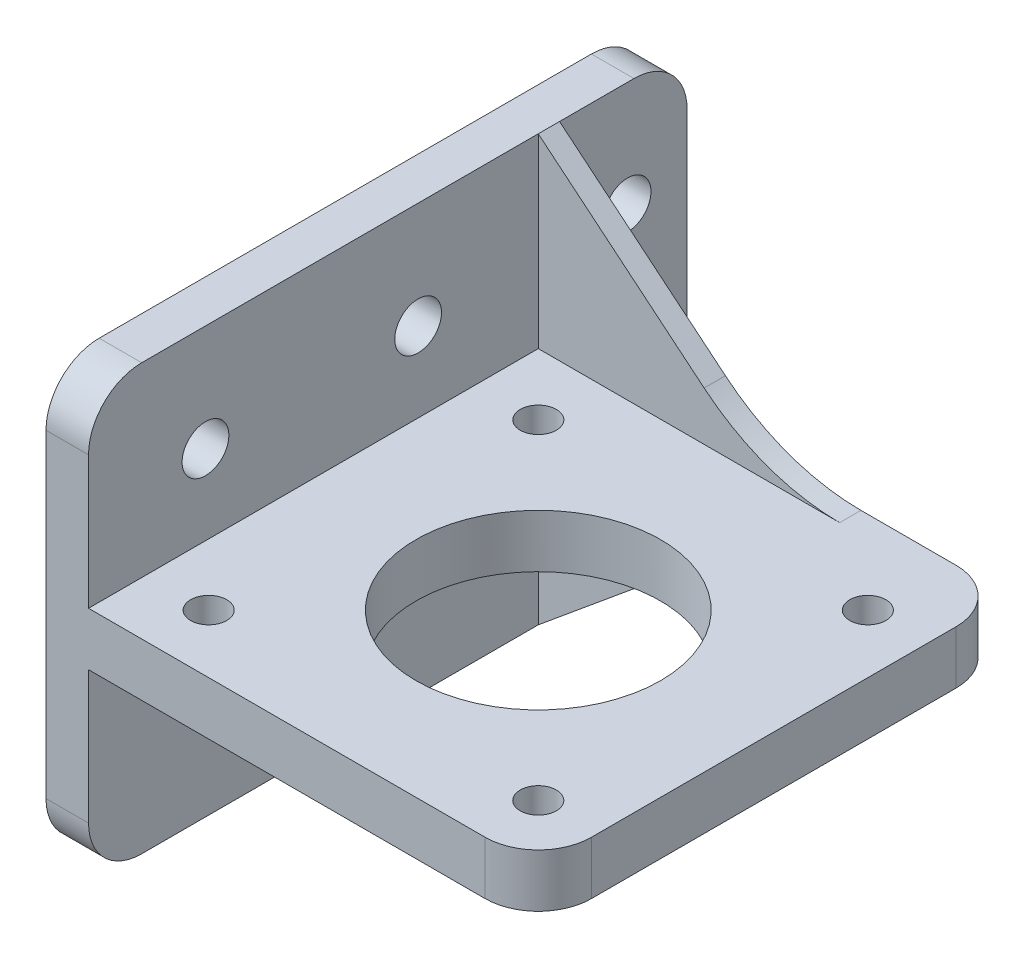
ISO-10303-21;
HEADER;
FILE_DESCRIPTION(('STEP AP214'),'2;1');
FILE_NAME('part.step','',(''),(''),'','','');
FILE_SCHEMA(('AUTOMOTIVE_DESIGN { 1 0 10303 214 1 1 1 1 }'));
ENDSEC;
DATA;
#1=APPLICATION_CONTEXT('core data for automotive mechanical design processes');
#2=APPLICATION_PROTOCOL_DEFINITION('international standard','automotive_design',2000,#1);
#3=PRODUCT_CONTEXT('',#1,'mechanical');
#4=PRODUCT('Part','Part','',(#3));
#5=PRODUCT_RELATED_PRODUCT_CATEGORY('part','',(#4));
#6=PRODUCT_DEFINITION_FORMATION('','',#4);
#7=PRODUCT_DEFINITION_CONTEXT('part definition',#1,'design');
#8=PRODUCT_DEFINITION('design','',#6,#7);
#9=PRODUCT_DEFINITION_SHAPE('','',#8);
#10=(LENGTH_UNIT() NAMED_UNIT(*) SI_UNIT(.MILLI.,.METRE.));
#11=(NAMED_UNIT(*) PLANE_ANGLE_UNIT() SI_UNIT($,.RADIAN.));
#12=(NAMED_UNIT(*) SI_UNIT($,.STERADIAN.) SOLID_ANGLE_UNIT());
#13=UNCERTAINTY_MEASURE_WITH_UNIT(LENGTH_MEASURE(1.E-05),#10,'distance_accuracy_value','');
#14=(GEOMETRIC_REPRESENTATION_CONTEXT(3) GLOBAL_UNCERTAINTY_ASSIGNED_CONTEXT((#13)) GLOBAL_UNIT_ASSIGNED_CONTEXT((#10,
#11,#12)) REPRESENTATION_CONTEXT('',''));
#15=CARTESIAN_POINT('',(0.,0.,0.));
#16=DIRECTION('',(0.,0.,1.));
#17=DIRECTION('',(1.,0.,0.));
#18=AXIS2_PLACEMENT_3D('',#15,#16,#17);
#19=CARTESIAN_POINT('',(0.,0.,-2.));
#20=DIRECTION('',(0.,0.,1.));
#21=DIRECTION('',(1.,0.,0.));
#22=AXIS2_PLACEMENT_3D('',#19,#20,#21);
#23=PLANE('',#22);
#24=DIRECTION('',(-1.,0.,0.));
#25=VECTOR('',#24,1.);
#26=CARTESIAN_POINT('',(0.,2.5,-2.));
#27=LINE('',#26,#25);
#28=CARTESIAN_POINT('',(37.3,2.5,-2.));
#29=VERTEX_POINT('',#28);
#30=CARTESIAN_POINT('',(28.3514571610582,2.5,-2.));
#31=VERTEX_POINT('',#30);
#32=EDGE_CURVE('E224',#29,#31,#27,.T.);
#33=ORIENTED_EDGE('',*,*,#32,.F.);
#34=DIRECTION('',(0.,1.,0.));
#35=VECTOR('',#34,1.);
#36=CARTESIAN_POINT('',(37.3,0.,-2.));
#37=LINE('',#36,#35);
#38=CARTESIAN_POINT('',(37.3,-2.5,-2.));
#39=VERTEX_POINT('',#38);
#40=EDGE_CURVE('E412',#29,#39,#37,.F.);
#41=ORIENTED_EDGE('',*,*,#40,.T.);
#42=DIRECTION('',(1.,0.,0.));
#43=VECTOR('',#42,1.);
#44=CARTESIAN_POINT('',(0.,-2.5,-2.));
#45=LINE('',#44,#43);
#46=CARTESIAN_POINT('',(28.3514571610582,-2.5,-2.));
#47=VERTEX_POINT('',#46);
#48=EDGE_CURVE('E184',#47,#39,#45,.T.);
#49=ORIENTED_EDGE('',*,*,#48,.F.);
#50=CARTESIAN_POINT('',(28.3514571610582,-22.5,-2.));
#51=DIRECTION('',(0.,0.,1.));
#52=DIRECTION('',(1.,0.,0.));
#53=AXIS2_PLACEMENT_3D('',#50,#51,#52);
#54=CIRCLE('',#53,20.);
#55=CARTESIAN_POINT('',(15.601594001808,-7.09087966753474,-2.));
#56=VERTEX_POINT('',#55);
#57=EDGE_CURVE('E11',#47,#56,#54,.T.);
#58=ORIENTED_EDGE('',*,*,#57,.T.);
#59=DIRECTION('',(-0.770456016623263,-0.637493157962511,0.));
#60=VECTOR('',#59,1.);
#61=CARTESIAN_POINT('',(9.82320878216761,-11.8720494710197,-2.));
#62=LINE('',#61,#60);
#63=CARTESIAN_POINT('',(0.,-20.,-2.));
#64=VERTEX_POINT('',#63);
#65=EDGE_CURVE('E172',#56,#64,#62,.T.);
#66=ORIENTED_EDGE('',*,*,#65,.T.);
#67=DIRECTION('',(0.,-1.,0.));
#68=VECTOR('',#67,1.);
#69=CARTESIAN_POINT('',(0.,0.,-2.));
#70=LINE('',#69,#68);
#71=CARTESIAN_POINT('',(0.,20.,-2.));
#72=VERTEX_POINT('',#71);
#73=EDGE_CURVE('E177',#72,#64,#70,.T.);
#74=ORIENTED_EDGE('',*,*,#73,.F.);
#75=DIRECTION('',(0.770456016623263,-0.637493157962511,0.));
#76=VECTOR('',#75,1.);
#77=CARTESIAN_POINT('',(9.82320878216761,11.8720494710197,-2.));
#78=LINE('',#77,#76);
#79=CARTESIAN_POINT('',(15.601594001808,7.09087966753474,-2.));
#80=VERTEX_POINT('',#79);
#81=EDGE_CURVE('E206',#72,#80,#78,.T.);
#82=ORIENTED_EDGE('',*,*,#81,.T.);
#83=CARTESIAN_POINT('',(28.3514571610582,22.5,-2.));
#84=DIRECTION('',(0.,0.,1.));
#85=DIRECTION('',(1.,0.,0.));
#86=AXIS2_PLACEMENT_3D('',#83,#84,#85);
#87=CIRCLE('',#86,20.);
#88=EDGE_CURVE('E301',#80,#31,#87,.T.);
#89=ORIENTED_EDGE('',*,*,#88,.T.);
#90=EDGE_LOOP('',(#33,#41,#49,#58,#66,#74,#82,#89));
#91=FACE_BOUND('',#90,.T.);
#92=ADVANCED_FACE('F37',(#91),#23,.F.);
#93=CARTESIAN_POINT('',(0.,0.,42.3));
#94=DIRECTION('',(1.,0.,0.));
#95=DIRECTION('',(0.,1.,0.));
#96=AXIS2_PLACEMENT_3D('',#93,#94,#95);
#97=PLANE('',#96);
#98=CARTESIAN_POINT('',(0.,-10.,11.3));
#99=DIRECTION('',(1.,0.,0.));
#100=DIRECTION('',(0.,0.,-1.));
#101=AXIS2_PLACEMENT_3D('',#98,#99,#100);
#102=CIRCLE('',#101,2.2);
#103=CARTESIAN_POINT('',(0.,-10.,9.1));
#104=VERTEX_POINT('',#103);
#105=EDGE_CURVE('E560',#104,#104,#102,.T.);
#106=ORIENTED_EDGE('',*,*,#105,.F.);
#107=EDGE_LOOP('',(#106));
#108=FACE_BOUND('',#107,.T.);
#109=CARTESIAN_POINT('',(0.,-10.,31.3));
#110=DIRECTION('',(1.,0.,0.));
#111=DIRECTION('',(0.,0.,1.));
#112=AXIS2_PLACEMENT_3D('',#109,#110,#111);
#113=CIRCLE('',#112,2.20000000000001);
#114=CARTESIAN_POINT('',(0.,-10.,33.5));
#115=VERTEX_POINT('',#114);
#116=EDGE_CURVE('E579',#115,#115,#113,.T.);
#117=ORIENTED_EDGE('',*,*,#116,.F.);
#118=EDGE_LOOP('',(#117));
#119=FACE_BOUND('',#118,.T.);
#120=DIRECTION('',(0.,-1.,0.));
#121=VECTOR('',#120,1.);
#122=CARTESIAN_POINT('',(0.,0.,42.3));
#123=LINE('',#122,#121);
#124=CARTESIAN_POINT('',(0.,-2.5,42.3));
#125=VERTEX_POINT('',#124);
#126=CARTESIAN_POINT('',(0.,-15.,42.3));
#127=VERTEX_POINT('',#126);
#128=EDGE_CURVE('E261',#125,#127,#123,.T.);
#129=ORIENTED_EDGE('',*,*,#128,.T.);
#130=CARTESIAN_POINT('',(0.,-15.,37.3));
#131=DIRECTION('',(1.,0.,0.));
#132=DIRECTION('',(0.,1.,0.));
#133=AXIS2_PLACEMENT_3D('',#130,#131,#132);
#134=CIRCLE('',#133,5.);
#135=CARTESIAN_POINT('',(0.,-20.,37.3));
#136=VERTEX_POINT('',#135);
#137=EDGE_CURVE('E485',#127,#136,#134,.T.);
#138=ORIENTED_EDGE('',*,*,#137,.T.);
#139=DIRECTION('',(0.,0.,-1.));
#140=VECTOR('',#139,1.);
#141=CARTESIAN_POINT('',(0.,-20.,42.3));
#142=LINE('',#141,#140);
#143=CARTESIAN_POINT('',(0.,-20.,0.));
#144=VERTEX_POINT('',#143);
#145=EDGE_CURVE('E276',#136,#144,#142,.T.);
#146=ORIENTED_EDGE('',*,*,#145,.T.);
#147=DIRECTION('',(0.,-1.,0.));
#148=VECTOR('',#147,1.);
#149=CARTESIAN_POINT('',(0.,0.,0.));
#150=LINE('',#149,#148);
#151=CARTESIAN_POINT('',(0.,-2.5,0.));
#152=VERTEX_POINT('',#151);
#153=EDGE_CURVE('E260',#152,#144,#150,.T.);
#154=ORIENTED_EDGE('',*,*,#153,.F.);
#155=DIRECTION('',(0.,0.,-1.));
#156=VECTOR('',#155,1.);
#157=CARTESIAN_POINT('',(0.,-2.5,42.3));
#158=LINE('',#157,#156);
#159=EDGE_CURVE('E454',#125,#152,#158,.T.);
#160=ORIENTED_EDGE('',*,*,#159,.F.);
#161=EDGE_LOOP('',(#129,#138,#146,#154,#160));
#162=FACE_BOUND('',#161,.T.);
#163=ADVANCED_FACE('F313',(#108,#119,#162),#97,.T.);
#164=CARTESIAN_POINT('',(0.,-2.5,42.3));
#165=DIRECTION('',(0.,1.,0.));
#166=DIRECTION('',(0.,0.,1.));
#167=AXIS2_PLACEMENT_3D('',#164,#165,#166);
#168=PLANE('',#167);
#169=CARTESIAN_POINT('',(5.79999999999982,-2.5,5.79999999999981));
#170=DIRECTION('',(0.,1.,0.));
#171=DIRECTION('',(0.,0.,1.));
#172=AXIS2_PLACEMENT_3D('',#169,#170,#171);
#173=CIRCLE('',#172,1.7);
#174=CARTESIAN_POINT('',(5.79999999999982,-2.5,7.49999999999981));
#175=VERTEX_POINT('',#174);
#176=EDGE_CURVE('E233',#175,#175,#173,.F.);
#177=ORIENTED_EDGE('',*,*,#176,.F.);
#178=EDGE_LOOP('',(#177));
#179=FACE_BOUND('',#178,.T.);
#180=CARTESIAN_POINT('',(5.79999999999983,-2.5,36.8000000000002));
#181=DIRECTION('',(0.,1.,0.));
#182=DIRECTION('',(0.,0.,1.));
#183=AXIS2_PLACEMENT_3D('',#180,#181,#182);
#184=CIRCLE('',#183,1.7);
#185=CARTESIAN_POINT('',(5.79999999999983,-2.5,38.5000000000002));
#186=VERTEX_POINT('',#185);
#187=EDGE_CURVE('E239',#186,#186,#184,.F.);
#188=ORIENTED_EDGE('',*,*,#187,.F.);
#189=EDGE_LOOP('',(#188));
#190=FACE_BOUND('',#189,.T.);
#191=CARTESIAN_POINT('',(36.8000000000002,-2.5,36.8000000000002));
#192=DIRECTION('',(0.,1.,0.));
#193=DIRECTION('',(0.,0.,1.));
#194=AXIS2_PLACEMENT_3D('',#191,#192,#193);
#195=CIRCLE('',#194,1.70000000000001);
#196=CARTESIAN_POINT('',(36.8000000000002,-2.5,38.5000000000002));
#197=VERTEX_POINT('',#196);
#198=EDGE_CURVE('E245',#197,#197,#195,.F.);
#199=ORIENTED_EDGE('',*,*,#198,.F.);
#200=EDGE_LOOP('',(#199));
#201=FACE_BOUND('',#200,.T.);
#202=CARTESIAN_POINT('',(36.8000000000002,-2.5,5.79999999999982));
#203=DIRECTION('',(0.,1.,0.));
#204=DIRECTION('',(0.,0.,1.));
#205=AXIS2_PLACEMENT_3D('',#202,#203,#204);
#206=CIRCLE('',#205,1.7);
#207=CARTESIAN_POINT('',(36.8000000000002,-2.5,7.49999999999982));
#208=VERTEX_POINT('',#207);
#209=EDGE_CURVE('E251',#208,#208,#206,.F.);
#210=ORIENTED_EDGE('',*,*,#209,.F.);
#211=EDGE_LOOP('',(#210));
#212=FACE_BOUND('',#211,.T.);
#213=CARTESIAN_POINT('',(21.3,-2.5,21.3));
#214=DIRECTION('',(0.,1.,0.));
#215=DIRECTION('',(0.,0.,1.));
#216=AXIS2_PLACEMENT_3D('',#213,#214,#215);
#217=CIRCLE('',#216,11.5);
#218=CARTESIAN_POINT('',(21.3,-2.5,32.8));
#219=VERTEX_POINT('',#218);
#220=EDGE_CURVE('E257',#219,#219,#217,.F.);
#221=ORIENTED_EDGE('',*,*,#220,.F.);
#222=EDGE_LOOP('',(#221));
#223=FACE_BOUND('',#222,.T.);
#224=DIRECTION('',(1.,0.,0.));
#225=VECTOR('',#224,1.);
#226=CARTESIAN_POINT('',(0.,-2.5,0.));
#227=LINE('',#226,#225);
#228=CARTESIAN_POINT('',(28.3514571610582,-2.5,0.));
#229=VERTEX_POINT('',#228);
#230=EDGE_CURVE('E52',#152,#229,#227,.T.);
#231=ORIENTED_EDGE('',*,*,#230,.T.);
#232=DIRECTION('',(0.,0.,1.));
#233=VECTOR('',#232,1.);
#234=CARTESIAN_POINT('',(28.3514571610582,-2.5,-2.));
#235=LINE('',#234,#233);
#236=EDGE_CURVE('E57',#229,#47,#235,.F.);
#237=ORIENTED_EDGE('',*,*,#236,.T.);
#238=ORIENTED_EDGE('',*,*,#48,.T.);
#239=CARTESIAN_POINT('',(37.3,-2.5,3.));
#240=DIRECTION('',(0.,1.,0.));
#241=DIRECTION('',(0.,0.,1.));
#242=AXIS2_PLACEMENT_3D('',#239,#240,#241);
#243=CIRCLE('',#242,5.);
#244=CARTESIAN_POINT('',(42.3,-2.5,3.));
#245=VERTEX_POINT('',#244);
#246=EDGE_CURVE('E410',#39,#245,#243,.F.);
#247=ORIENTED_EDGE('',*,*,#246,.T.);
#248=DIRECTION('',(0.,0.,-1.));
#249=VECTOR('',#248,1.);
#250=CARTESIAN_POINT('',(42.3,-2.5,42.3));
#251=LINE('',#250,#249);
#252=CARTESIAN_POINT('',(42.3,-2.5,37.3));
#253=VERTEX_POINT('',#252);
#254=EDGE_CURVE('E453',#253,#245,#251,.T.);
#255=ORIENTED_EDGE('',*,*,#254,.F.);
#256=CARTESIAN_POINT('',(37.3,-2.5,37.3));
#257=DIRECTION('',(0.,1.,0.));
#258=DIRECTION('',(0.,0.,1.));
#259=AXIS2_PLACEMENT_3D('',#256,#257,#258);
#260=CIRCLE('',#259,5.);
#261=CARTESIAN_POINT('',(37.3,-2.5,42.3));
#262=VERTEX_POINT('',#261);
#263=EDGE_CURVE('E417',#253,#262,#260,.F.);
#264=ORIENTED_EDGE('',*,*,#263,.T.);
#265=DIRECTION('',(1.,0.,0.));
#266=VECTOR('',#265,1.);
#267=CARTESIAN_POINT('',(0.,-2.5,42.3));
#268=LINE('',#267,#266);
#269=EDGE_CURVE('E264',#125,#262,#268,.T.);
#270=ORIENTED_EDGE('',*,*,#269,.F.);
#271=ORIENTED_EDGE('',*,*,#159,.T.);
#272=EDGE_LOOP('',(#231,#237,#238,#247,#255,#264,#270,#271));
#273=FACE_BOUND('',#272,.T.);
#274=ADVANCED_FACE('F318',(#179,#190,#201,#212,#223,#273),#168,.F.);
#275=CARTESIAN_POINT('',(42.3,0.,42.3));
#276=DIRECTION('',(-1.,0.,0.));
#277=DIRECTION('',(0.,0.,1.));
#278=AXIS2_PLACEMENT_3D('',#275,#276,#277);
#279=PLANE('',#278);
#280=DIRECTION('',(0.,0.,-1.));
#281=VECTOR('',#280,1.);
#282=CARTESIAN_POINT('',(42.3,2.5,42.3));
#283=LINE('',#282,#281);
#284=CARTESIAN_POINT('',(42.3,2.5,37.3));
#285=VERTEX_POINT('',#284);
#286=CARTESIAN_POINT('',(42.3,2.5,3.));
#287=VERTEX_POINT('',#286);
#288=EDGE_CURVE('E450',#285,#287,#283,.T.);
#289=ORIENTED_EDGE('',*,*,#288,.F.);
#290=DIRECTION('',(0.,1.,0.));
#291=VECTOR('',#290,1.);
#292=CARTESIAN_POINT('',(42.3,-2.5,37.3));
#293=LINE('',#292,#291);
#294=EDGE_CURVE('E418',#285,#253,#293,.F.);
#295=ORIENTED_EDGE('',*,*,#294,.T.);
#296=ORIENTED_EDGE('',*,*,#254,.T.);
#297=DIRECTION('',(0.,1.,0.));
#298=VECTOR('',#297,1.);
#299=CARTESIAN_POINT('',(42.3,0.,3.));
#300=LINE('',#299,#298);
#301=EDGE_CURVE('E414',#245,#287,#300,.T.);
#302=ORIENTED_EDGE('',*,*,#301,.T.);
#303=EDGE_LOOP('',(#289,#295,#296,#302));
#304=FACE_BOUND('',#303,.T.);
#305=ADVANCED_FACE('F374',(#304),#279,.F.);
#306=CARTESIAN_POINT('',(0.,2.5,42.3));
#307=DIRECTION('',(0.,-1.,0.));
#308=DIRECTION('',(1.,0.,0.));
#309=AXIS2_PLACEMENT_3D('',#306,#307,#308);
#310=PLANE('',#309);
#311=CARTESIAN_POINT('',(5.79999999999982,2.5,5.79999999999981));
#312=DIRECTION('',(0.,-1.,0.));
#313=DIRECTION('',(1.,0.,0.));
#314=AXIS2_PLACEMENT_3D('',#311,#312,#313);
#315=CIRCLE('',#314,1.7);
#316=CARTESIAN_POINT('',(7.49999999999982,2.5,5.79999999999981));
#317=VERTEX_POINT('',#316);
#318=EDGE_CURVE('E229',#317,#317,#315,.T.);
#319=ORIENTED_EDGE('',*,*,#318,.T.);
#320=EDGE_LOOP('',(#319));
#321=FACE_BOUND('',#320,.T.);
#322=CARTESIAN_POINT('',(5.79999999999983,2.5,36.8000000000002));
#323=DIRECTION('',(0.,-1.,0.));
#324=DIRECTION('',(1.,0.,0.));
#325=AXIS2_PLACEMENT_3D('',#322,#323,#324);
#326=CIRCLE('',#325,1.7);
#327=CARTESIAN_POINT('',(7.49999999999982,2.5,36.8000000000002));
#328=VERTEX_POINT('',#327);
#329=EDGE_CURVE('E236',#328,#328,#326,.T.);
#330=ORIENTED_EDGE('',*,*,#329,.T.);
#331=EDGE_LOOP('',(#330));
#332=FACE_BOUND('',#331,.T.);
#333=CARTESIAN_POINT('',(36.8000000000002,2.5,36.8000000000002));
#334=DIRECTION('',(0.,-1.,0.));
#335=DIRECTION('',(1.,0.,0.));
#336=AXIS2_PLACEMENT_3D('',#333,#334,#335);
#337=CIRCLE('',#336,1.70000000000001);
#338=CARTESIAN_POINT('',(38.5000000000002,2.5,36.8000000000002));
#339=VERTEX_POINT('',#338);
#340=EDGE_CURVE('E242',#339,#339,#337,.T.);
#341=ORIENTED_EDGE('',*,*,#340,.T.);
#342=EDGE_LOOP('',(#341));
#343=FACE_BOUND('',#342,.T.);
#344=CARTESIAN_POINT('',(36.8000000000002,2.5,5.79999999999982));
#345=DIRECTION('',(0.,-1.,0.));
#346=DIRECTION('',(1.,0.,0.));
#347=AXIS2_PLACEMENT_3D('',#344,#345,#346);
#348=CIRCLE('',#347,1.7);
#349=CARTESIAN_POINT('',(38.5000000000002,2.5,5.79999999999982));
#350=VERTEX_POINT('',#349);
#351=EDGE_CURVE('E248',#350,#350,#348,.T.);
#352=ORIENTED_EDGE('',*,*,#351,.T.);
#353=EDGE_LOOP('',(#352));
#354=FACE_BOUND('',#353,.T.);
#355=CARTESIAN_POINT('',(21.3,2.5,21.3));
#356=DIRECTION('',(0.,-1.,0.));
#357=DIRECTION('',(1.,0.,0.));
#358=AXIS2_PLACEMENT_3D('',#355,#356,#357);
#359=CIRCLE('',#358,11.5);
#360=CARTESIAN_POINT('',(32.8,2.5,21.3));
#361=VERTEX_POINT('',#360);
#362=EDGE_CURVE('E254',#361,#361,#359,.T.);
#363=ORIENTED_EDGE('',*,*,#362,.T.);
#364=EDGE_LOOP('',(#363));
#365=FACE_BOUND('',#364,.T.);
#366=ORIENTED_EDGE('',*,*,#32,.T.);
#367=DIRECTION('',(0.,0.,1.));
#368=VECTOR('',#367,1.);
#369=CARTESIAN_POINT('',(28.3514571610582,2.5,0.));
#370=LINE('',#369,#368);
#371=CARTESIAN_POINT('',(28.3514571610582,2.5,0.));
#372=VERTEX_POINT('',#371);
#373=EDGE_CURVE('E424',#31,#372,#370,.T.);
#374=ORIENTED_EDGE('',*,*,#373,.T.);
#375=DIRECTION('',(-1.,0.,0.));
#376=VECTOR('',#375,1.);
#377=CARTESIAN_POINT('',(0.,2.5,0.));
#378=LINE('',#377,#376);
#379=CARTESIAN_POINT('',(0.,2.5,0.));
#380=VERTEX_POINT('',#379);
#381=EDGE_CURVE('E286',#372,#380,#378,.T.);
#382=ORIENTED_EDGE('',*,*,#381,.T.);
#383=DIRECTION('',(0.,0.,-1.));
#384=VECTOR('',#383,1.);
#385=CARTESIAN_POINT('',(0.,2.5,42.3));
#386=LINE('',#385,#384);
#387=CARTESIAN_POINT('',(0.,2.5,42.3));
#388=VERTEX_POINT('',#387);
#389=EDGE_CURVE('E448',#388,#380,#386,.T.);
#390=ORIENTED_EDGE('',*,*,#389,.F.);
#391=DIRECTION('',(-1.,0.,0.));
#392=VECTOR('',#391,1.);
#393=CARTESIAN_POINT('',(0.,2.5,42.3));
#394=LINE('',#393,#392);
#395=CARTESIAN_POINT('',(37.3,2.5,42.3));
#396=VERTEX_POINT('',#395);
#397=EDGE_CURVE('E268',#396,#388,#394,.T.);
#398=ORIENTED_EDGE('',*,*,#397,.F.);
#399=CARTESIAN_POINT('',(37.3,2.5,37.3));
#400=DIRECTION('',(0.,-1.,0.));
#401=DIRECTION('',(1.,0.,0.));
#402=AXIS2_PLACEMENT_3D('',#399,#400,#401);
#403=CIRCLE('',#402,5.);
#404=EDGE_CURVE('E500',#396,#285,#403,.F.);
#405=ORIENTED_EDGE('',*,*,#404,.T.);
#406=ORIENTED_EDGE('',*,*,#288,.T.);
#407=CARTESIAN_POINT('',(37.3,2.5,3.));
#408=DIRECTION('',(0.,-1.,0.));
#409=DIRECTION('',(1.,0.,0.));
#410=AXIS2_PLACEMENT_3D('',#407,#408,#409);
#411=CIRCLE('',#410,5.);
#412=EDGE_CURVE('E498',#287,#29,#411,.F.);
#413=ORIENTED_EDGE('',*,*,#412,.T.);
#414=EDGE_LOOP('',(#366,#374,#382,#390,#398,#405,#406,#413));
#415=FACE_BOUND('',#414,.T.);
#416=ADVANCED_FACE('F370',(#321,#332,#343,#354,#365,#415),#310,.F.);
#417=CARTESIAN_POINT('',(0.,0.,42.3));
#418=DIRECTION('',(1.,0.,0.));
#419=DIRECTION('',(0.,1.,0.));
#420=AXIS2_PLACEMENT_3D('',#417,#418,#419);
#421=PLANE('',#420);
#422=CARTESIAN_POINT('',(0.,10.,11.3));
#423=DIRECTION('',(1.,0.,0.));
#424=DIRECTION('',(0.,0.,1.));
#425=AXIS2_PLACEMENT_3D('',#422,#423,#424);
#426=CIRCLE('',#425,2.2);
#427=CARTESIAN_POINT('',(0.,10.,13.5));
#428=VERTEX_POINT('',#427);
#429=EDGE_CURVE('E564',#428,#428,#426,.T.);
#430=ORIENTED_EDGE('',*,*,#429,.F.);
#431=EDGE_LOOP('',(#430));
#432=FACE_BOUND('',#431,.T.);
#433=CARTESIAN_POINT('',(0.,10.,31.3));
#434=DIRECTION('',(1.,0.,0.));
#435=DIRECTION('',(0.,0.,-1.));
#436=AXIS2_PLACEMENT_3D('',#433,#434,#435);
#437=CIRCLE('',#436,2.20000000000001);
#438=CARTESIAN_POINT('',(0.,10.,29.1));
#439=VERTEX_POINT('',#438);
#440=EDGE_CURVE('E585',#439,#439,#437,.T.);
#441=ORIENTED_EDGE('',*,*,#440,.F.);
#442=EDGE_LOOP('',(#441));
#443=FACE_BOUND('',#442,.T.);
#444=DIRECTION('',(0.,0.,-1.));
#445=VECTOR('',#444,1.);
#446=CARTESIAN_POINT('',(0.,20.,42.3));
#447=LINE('',#446,#445);
#448=CARTESIAN_POINT('',(0.,20.,37.3));
#449=VERTEX_POINT('',#448);
#450=CARTESIAN_POINT('',(0.,20.,0.));
#451=VERTEX_POINT('',#450);
#452=EDGE_CURVE('E446',#449,#451,#447,.T.);
#453=ORIENTED_EDGE('',*,*,#452,.F.);
#454=CARTESIAN_POINT('',(0.,15.,37.3));
#455=DIRECTION('',(1.,0.,0.));
#456=DIRECTION('',(0.,1.,0.));
#457=AXIS2_PLACEMENT_3D('',#454,#455,#456);
#458=CIRCLE('',#457,5.);
#459=CARTESIAN_POINT('',(0.,15.,42.3));
#460=VERTEX_POINT('',#459);
#461=EDGE_CURVE('E483',#449,#460,#458,.T.);
#462=ORIENTED_EDGE('',*,*,#461,.T.);
#463=DIRECTION('',(0.,-1.,0.));
#464=VECTOR('',#463,1.);
#465=CARTESIAN_POINT('',(0.,0.,42.3));
#466=LINE('',#465,#464);
#467=EDGE_CURVE('E271',#460,#388,#466,.T.);
#468=ORIENTED_EDGE('',*,*,#467,.T.);
#469=ORIENTED_EDGE('',*,*,#389,.T.);
#470=DIRECTION('',(0.,-1.,0.));
#471=VECTOR('',#470,1.);
#472=CARTESIAN_POINT('',(0.,0.,0.));
#473=LINE('',#472,#471);
#474=EDGE_CURVE('E265',#451,#380,#473,.T.);
#475=ORIENTED_EDGE('',*,*,#474,.F.);
#476=EDGE_LOOP('',(#453,#462,#468,#469,#475));
#477=FACE_BOUND('',#476,.T.);
#478=ADVANCED_FACE('F366',(#432,#443,#477),#421,.T.);
#479=CARTESIAN_POINT('',(0.,20.,42.3));
#480=DIRECTION('',(0.,-1.,0.));
#481=DIRECTION('',(0.,0.,-1.));
#482=AXIS2_PLACEMENT_3D('',#479,#480,#481);
#483=PLANE('',#482);
#484=DIRECTION('',(0.,0.,-1.));
#485=VECTOR('',#484,1.);
#486=CARTESIAN_POINT('',(-4.,20.,42.3));
#487=LINE('',#486,#485);
#488=CARTESIAN_POINT('',(-4.,20.,37.3));
#489=VERTEX_POINT('',#488);
#490=CARTESIAN_POINT('',(-4.,20.,-9.));
#491=VERTEX_POINT('',#490);
#492=EDGE_CURVE('E443',#489,#491,#487,.T.);
#493=ORIENTED_EDGE('',*,*,#492,.F.);
#494=DIRECTION('',(-1.,0.,0.));
#495=VECTOR('',#494,1.);
#496=CARTESIAN_POINT('',(0.,20.,37.3));
#497=LINE('',#496,#495);
#498=EDGE_CURVE('E481',#489,#449,#497,.F.);
#499=ORIENTED_EDGE('',*,*,#498,.T.);
#500=ORIENTED_EDGE('',*,*,#452,.T.);
#501=DIRECTION('',(0.,0.,1.));
#502=VECTOR('',#501,1.);
#503=CARTESIAN_POINT('',(0.,20.,-2.));
#504=LINE('',#503,#502);
#505=EDGE_CURVE('E205',#72,#451,#504,.T.);
#506=ORIENTED_EDGE('',*,*,#505,.F.);
#507=DIRECTION('',(0.,0.,1.));
#508=VECTOR('',#507,1.);
#509=CARTESIAN_POINT('',(0.,20.,-14.));
#510=LINE('',#509,#508);
#511=CARTESIAN_POINT('',(0.,20.,-9.));
#512=VERTEX_POINT('',#511);
#513=EDGE_CURVE('E200',#512,#72,#510,.T.);
#514=ORIENTED_EDGE('',*,*,#513,.F.);
#515=DIRECTION('',(-1.,0.,0.));
#516=VECTOR('',#515,1.);
#517=CARTESIAN_POINT('',(0.,20.,-9.));
#518=LINE('',#517,#516);
#519=EDGE_CURVE('E478',#512,#491,#518,.T.);
#520=ORIENTED_EDGE('',*,*,#519,.T.);
#521=EDGE_LOOP('',(#493,#499,#500,#506,#514,#520));
#522=FACE_BOUND('',#521,.T.);
#523=ADVANCED_FACE('F362',(#522),#483,.F.);
#524=CARTESIAN_POINT('',(-4.,0.,42.3));
#525=DIRECTION('',(1.,0.,0.));
#526=DIRECTION('',(0.,1.,0.));
#527=AXIS2_PLACEMENT_3D('',#524,#525,#526);
#528=PLANE('',#527);
#529=CARTESIAN_POINT('',(-4.,-10.,11.3));
#530=DIRECTION('',(1.,0.,0.));
#531=DIRECTION('',(0.,1.,0.));
#532=AXIS2_PLACEMENT_3D('',#529,#530,#531);
#533=CIRCLE('',#532,2.2);
#534=CARTESIAN_POINT('',(-4.,-7.8,11.3));
#535=VERTEX_POINT('',#534);
#536=EDGE_CURVE('E563',#535,#535,#533,.F.);
#537=ORIENTED_EDGE('',*,*,#536,.F.);
#538=EDGE_LOOP('',(#537));
#539=FACE_BOUND('',#538,.T.);
#540=CARTESIAN_POINT('',(-4.,10.,11.3));
#541=DIRECTION('',(1.,0.,0.));
#542=DIRECTION('',(0.,1.,0.));
#543=AXIS2_PLACEMENT_3D('',#540,#541,#542);
#544=CIRCLE('',#543,2.2);
#545=CARTESIAN_POINT('',(-4.,12.2,11.3));
#546=VERTEX_POINT('',#545);
#547=EDGE_CURVE('E567',#546,#546,#544,.F.);
#548=ORIENTED_EDGE('',*,*,#547,.F.);
#549=EDGE_LOOP('',(#548));
#550=FACE_BOUND('',#549,.T.);
#551=CARTESIAN_POINT('',(-4.,-10.,-8.39999999999996));
#552=DIRECTION('',(1.,0.,0.));
#553=DIRECTION('',(0.,1.,0.));
#554=AXIS2_PLACEMENT_3D('',#551,#552,#553);
#555=CIRCLE('',#554,2.2);
#556=CARTESIAN_POINT('',(-4.,-7.8,-8.39999999999996));
#557=VERTEX_POINT('',#556);
#558=EDGE_CURVE('E576',#557,#557,#555,.F.);
#559=ORIENTED_EDGE('',*,*,#558,.F.);
#560=EDGE_LOOP('',(#559));
#561=FACE_BOUND('',#560,.T.);
#562=CARTESIAN_POINT('',(-4.,-10.,31.3));
#563=DIRECTION('',(1.,0.,0.));
#564=DIRECTION('',(0.,1.,0.));
#565=AXIS2_PLACEMENT_3D('',#562,#563,#564);
#566=CIRCLE('',#565,2.20000000000001);
#567=CARTESIAN_POINT('',(-4.,-7.79999999999999,31.3));
#568=VERTEX_POINT('',#567);
#569=EDGE_CURVE('E582',#568,#568,#566,.F.);
#570=ORIENTED_EDGE('',*,*,#569,.F.);
#571=EDGE_LOOP('',(#570));
#572=FACE_BOUND('',#571,.T.);
#573=CARTESIAN_POINT('',(-4.,10.,31.3));
#574=DIRECTION('',(1.,0.,0.));
#575=DIRECTION('',(0.,1.,0.));
#576=AXIS2_PLACEMENT_3D('',#573,#574,#575);
#577=CIRCLE('',#576,2.20000000000001);
#578=CARTESIAN_POINT('',(-4.,12.2,31.3));
#579=VERTEX_POINT('',#578);
#580=EDGE_CURVE('E588',#579,#579,#577,.F.);
#581=ORIENTED_EDGE('',*,*,#580,.F.);
#582=EDGE_LOOP('',(#581));
#583=FACE_BOUND('',#582,.T.);
#584=CARTESIAN_POINT('',(-4.,10.,-8.39999999999996));
#585=DIRECTION('',(1.,0.,0.));
#586=DIRECTION('',(0.,1.,0.));
#587=AXIS2_PLACEMENT_3D('',#584,#585,#586);
#588=CIRCLE('',#587,2.2);
#589=CARTESIAN_POINT('',(-4.,12.2,-8.39999999999996));
#590=VERTEX_POINT('',#589);
#591=EDGE_CURVE('E212',#590,#590,#588,.F.);
#592=ORIENTED_EDGE('',*,*,#591,.F.);
#593=EDGE_LOOP('',(#592));
#594=FACE_BOUND('',#593,.T.);
#595=DIRECTION('',(0.,-1.,0.));
#596=VECTOR('',#595,1.);
#597=CARTESIAN_POINT('',(-4.,0.,42.3));
#598=LINE('',#597,#596);
#599=CARTESIAN_POINT('',(-4.,15.,42.3));
#600=VERTEX_POINT('',#599);
#601=CARTESIAN_POINT('',(-4.,-15.,42.3));
#602=VERTEX_POINT('',#601);
#603=EDGE_CURVE('E273',#600,#602,#598,.T.);
#604=ORIENTED_EDGE('',*,*,#603,.F.);
#605=CARTESIAN_POINT('',(-4.,15.,37.3));
#606=DIRECTION('',(1.,0.,0.));
#607=DIRECTION('',(0.,1.,0.));
#608=AXIS2_PLACEMENT_3D('',#605,#606,#607);
#609=CIRCLE('',#608,5.);
#610=EDGE_CURVE('E476',#600,#489,#609,.F.);
#611=ORIENTED_EDGE('',*,*,#610,.T.);
#612=ORIENTED_EDGE('',*,*,#492,.T.);
#613=CARTESIAN_POINT('',(-4.,15.,-9.));
#614=DIRECTION('',(1.,0.,0.));
#615=DIRECTION('',(0.,1.,0.));
#616=AXIS2_PLACEMENT_3D('',#613,#614,#615);
#617=CIRCLE('',#616,5.);
#618=CARTESIAN_POINT('',(-4.,15.,-14.));
#619=VERTEX_POINT('',#618);
#620=EDGE_CURVE('E472',#491,#619,#617,.F.);
#621=ORIENTED_EDGE('',*,*,#620,.T.);
#622=DIRECTION('',(0.,-1.,0.));
#623=VECTOR('',#622,1.);
#624=CARTESIAN_POINT('',(-4.,0.,-14.));
#625=LINE('',#624,#623);
#626=CARTESIAN_POINT('',(-4.,-15.,-14.));
#627=VERTEX_POINT('',#626);
#628=EDGE_CURVE('E215',#619,#627,#625,.T.);
#629=ORIENTED_EDGE('',*,*,#628,.T.);
#630=CARTESIAN_POINT('',(-4.,-15.,-9.));
#631=DIRECTION('',(1.,0.,0.));
#632=DIRECTION('',(0.,1.,0.));
#633=AXIS2_PLACEMENT_3D('',#630,#631,#632);
#634=CIRCLE('',#633,5.);
#635=CARTESIAN_POINT('',(-4.,-20.,-9.));
#636=VERTEX_POINT('',#635);
#637=EDGE_CURVE('E470',#627,#636,#634,.F.);
#638=ORIENTED_EDGE('',*,*,#637,.T.);
#639=DIRECTION('',(0.,0.,-1.));
#640=VECTOR('',#639,1.);
#641=CARTESIAN_POINT('',(-4.,-20.,42.3));
#642=LINE('',#641,#640);
#643=CARTESIAN_POINT('',(-4.,-20.,37.3));
#644=VERTEX_POINT('',#643);
#645=EDGE_CURVE('E441',#644,#636,#642,.T.);
#646=ORIENTED_EDGE('',*,*,#645,.F.);
#647=CARTESIAN_POINT('',(-4.,-15.,37.3));
#648=DIRECTION('',(1.,0.,0.));
#649=DIRECTION('',(0.,1.,0.));
#650=AXIS2_PLACEMENT_3D('',#647,#648,#649);
#651=CIRCLE('',#650,5.);
#652=EDGE_CURVE('E474',#644,#602,#651,.F.);
#653=ORIENTED_EDGE('',*,*,#652,.T.);
#654=EDGE_LOOP('',(#604,#611,#612,#621,#629,#638,#646,#653));
#655=FACE_BOUND('',#654,.T.);
#656=ADVANCED_FACE('F359',(#539,#550,#561,#572,#583,#594,#655),#528,.F.);
#657=CARTESIAN_POINT('',(0.,-20.,42.3));
#658=DIRECTION('',(0.,1.,0.));
#659=DIRECTION('',(0.,0.,1.));
#660=AXIS2_PLACEMENT_3D('',#657,#658,#659);
#661=PLANE('',#660);
#662=ORIENTED_EDGE('',*,*,#145,.F.);
#663=DIRECTION('',(1.,0.,0.));
#664=VECTOR('',#663,1.);
#665=CARTESIAN_POINT('',(-4.,-20.,37.3));
#666=LINE('',#665,#664);
#667=EDGE_CURVE('E488',#136,#644,#666,.F.);
#668=ORIENTED_EDGE('',*,*,#667,.T.);
#669=ORIENTED_EDGE('',*,*,#645,.T.);
#670=DIRECTION('',(1.,0.,0.));
#671=VECTOR('',#670,1.);
#672=CARTESIAN_POINT('',(0.,-20.,-9.));
#673=LINE('',#672,#671);
#674=CARTESIAN_POINT('',(0.,-20.,-9.));
#675=VERTEX_POINT('',#674);
#676=EDGE_CURVE('E197',#636,#675,#673,.T.);
#677=ORIENTED_EDGE('',*,*,#676,.T.);
#678=DIRECTION('',(0.,0.,1.));
#679=VECTOR('',#678,1.);
#680=CARTESIAN_POINT('',(0.,-20.,-14.));
#681=LINE('',#680,#679);
#682=EDGE_CURVE('E191',#675,#64,#681,.T.);
#683=ORIENTED_EDGE('',*,*,#682,.T.);
#684=DIRECTION('',(0.,0.,1.));
#685=VECTOR('',#684,1.);
#686=CARTESIAN_POINT('',(0.,-20.,-2.));
#687=LINE('',#686,#685);
#688=EDGE_CURVE('E194',#64,#144,#687,.T.);
#689=ORIENTED_EDGE('',*,*,#688,.T.);
#690=EDGE_LOOP('',(#662,#668,#669,#677,#683,#689));
#691=FACE_BOUND('',#690,.T.);
#692=ADVANCED_FACE('F193',(#691),#661,.F.);
#693=CARTESIAN_POINT('',(0.,0.,42.3));
#694=DIRECTION('',(0.,0.,1.));
#695=DIRECTION('',(1.,0.,0.));
#696=AXIS2_PLACEMENT_3D('',#693,#694,#695);
#697=PLANE('',#696);
#698=ORIENTED_EDGE('',*,*,#467,.F.);
#699=DIRECTION('',(-1.,0.,0.));
#700=VECTOR('',#699,1.);
#701=CARTESIAN_POINT('',(-4.,15.,42.3));
#702=LINE('',#701,#700);
#703=EDGE_CURVE('E464',#460,#600,#702,.T.);
#704=ORIENTED_EDGE('',*,*,#703,.T.);
#705=ORIENTED_EDGE('',*,*,#603,.T.);
#706=DIRECTION('',(1.,0.,0.));
#707=VECTOR('',#706,1.);
#708=CARTESIAN_POINT('',(0.,-15.,42.3));
#709=LINE('',#708,#707);
#710=EDGE_CURVE('E459',#602,#127,#709,.T.);
#711=ORIENTED_EDGE('',*,*,#710,.T.);
#712=ORIENTED_EDGE('',*,*,#128,.F.);
#713=ORIENTED_EDGE('',*,*,#269,.T.);
#714=DIRECTION('',(0.,1.,0.));
#715=VECTOR('',#714,1.);
#716=CARTESIAN_POINT('',(37.3,2.5,42.3));
#717=LINE('',#716,#715);
#718=EDGE_CURVE('E455',#262,#396,#717,.T.);
#719=ORIENTED_EDGE('',*,*,#718,.T.);
#720=ORIENTED_EDGE('',*,*,#397,.T.);
#721=EDGE_LOOP('',(#698,#704,#705,#711,#712,#713,#719,#720));
#722=FACE_BOUND('',#721,.T.);
#723=ADVANCED_FACE('F352',(#722),#697,.T.);
#724=CARTESIAN_POINT('',(21.3,-20.001,21.3));
#725=DIRECTION('',(0.,1.,0.));
#726=DIRECTION('',(0.,0.,1.));
#727=AXIS2_PLACEMENT_3D('',#724,#725,#726);
#728=CYLINDRICAL_SURFACE('',#727,11.5);
#729=ORIENTED_EDGE('',*,*,#220,.T.);
#730=EDGE_LOOP('',(#729));
#731=FACE_BOUND('',#730,.T.);
#732=ORIENTED_EDGE('',*,*,#362,.F.);
#733=EDGE_LOOP('',(#732));
#734=FACE_BOUND('',#733,.T.);
#735=ADVANCED_FACE('F348',(#731,#734),#728,.F.);
#736=CARTESIAN_POINT('',(36.8000000000002,-20.001,5.79999999999982));
#737=DIRECTION('',(0.,1.,0.));
#738=DIRECTION('',(0.,0.,1.));
#739=AXIS2_PLACEMENT_3D('',#736,#737,#738);
#740=CYLINDRICAL_SURFACE('',#739,1.7);
#741=ORIENTED_EDGE('',*,*,#209,.T.);
#742=EDGE_LOOP('',(#741));
#743=FACE_BOUND('',#742,.T.);
#744=ORIENTED_EDGE('',*,*,#351,.F.);
#745=EDGE_LOOP('',(#744));
#746=FACE_BOUND('',#745,.T.);
#747=ADVANCED_FACE('F344',(#743,#746),#740,.F.);
#748=CARTESIAN_POINT('',(36.8000000000002,-20.001,36.8000000000002));
#749=DIRECTION('',(0.,1.,0.));
#750=DIRECTION('',(0.,0.,1.));
#751=AXIS2_PLACEMENT_3D('',#748,#749,#750);
#752=CYLINDRICAL_SURFACE('',#751,1.70000000000001);
#753=ORIENTED_EDGE('',*,*,#198,.T.);
#754=EDGE_LOOP('',(#753));
#755=FACE_BOUND('',#754,.T.);
#756=ORIENTED_EDGE('',*,*,#340,.F.);
#757=EDGE_LOOP('',(#756));
#758=FACE_BOUND('',#757,.T.);
#759=ADVANCED_FACE('F340',(#755,#758),#752,.F.);
#760=CARTESIAN_POINT('',(5.79999999999983,-20.001,36.8000000000002));
#761=DIRECTION('',(0.,1.,0.));
#762=DIRECTION('',(0.,0.,1.));
#763=AXIS2_PLACEMENT_3D('',#760,#761,#762);
#764=CYLINDRICAL_SURFACE('',#763,1.7);
#765=ORIENTED_EDGE('',*,*,#187,.T.);
#766=EDGE_LOOP('',(#765));
#767=FACE_BOUND('',#766,.T.);
#768=ORIENTED_EDGE('',*,*,#329,.F.);
#769=EDGE_LOOP('',(#768));
#770=FACE_BOUND('',#769,.T.);
#771=ADVANCED_FACE('F336',(#767,#770),#764,.F.);
#772=CARTESIAN_POINT('',(5.79999999999982,-20.001,5.79999999999981));
#773=DIRECTION('',(0.,1.,0.));
#774=DIRECTION('',(0.,0.,1.));
#775=AXIS2_PLACEMENT_3D('',#772,#773,#774);
#776=CYLINDRICAL_SURFACE('',#775,1.7);
#777=ORIENTED_EDGE('',*,*,#176,.T.);
#778=EDGE_LOOP('',(#777));
#779=FACE_BOUND('',#778,.T.);
#780=ORIENTED_EDGE('',*,*,#318,.F.);
#781=EDGE_LOOP('',(#780));
#782=FACE_BOUND('',#781,.T.);
#783=ADVANCED_FACE('F333',(#779,#782),#776,.F.);
#784=CARTESIAN_POINT('',(0.,0.,0.));
#785=DIRECTION('',(0.,0.,1.));
#786=DIRECTION('',(1.,0.,0.));
#787=AXIS2_PLACEMENT_3D('',#784,#785,#786);
#788=PLANE('',#787);
#789=DIRECTION('',(0.770456016623263,-0.637493157962511,0.));
#790=VECTOR('',#789,1.);
#791=CARTESIAN_POINT('',(9.82320878216761,11.8720494710197,0.));
#792=LINE('',#791,#790);
#793=CARTESIAN_POINT('',(15.601594001808,7.09087966753474,0.));
#794=VERTEX_POINT('',#793);
#795=EDGE_CURVE('E185',#451,#794,#792,.T.);
#796=ORIENTED_EDGE('',*,*,#795,.F.);
#797=ORIENTED_EDGE('',*,*,#474,.T.);
#798=ORIENTED_EDGE('',*,*,#381,.F.);
#799=CARTESIAN_POINT('',(28.3514571610582,22.5,0.));
#800=DIRECTION('',(0.,0.,1.));
#801=DIRECTION('',(1.,0.,0.));
#802=AXIS2_PLACEMENT_3D('',#799,#800,#801);
#803=CIRCLE('',#802,20.);
#804=EDGE_CURVE('E299',#372,#794,#803,.F.);
#805=ORIENTED_EDGE('',*,*,#804,.T.);
#806=EDGE_LOOP('',(#796,#797,#798,#805));
#807=FACE_BOUND('',#806,.T.);
#808=ADVANCED_FACE('F326',(#807),#788,.T.);
#809=CARTESIAN_POINT('',(9.82320878216761,11.8720494710197,-2.));
#810=DIRECTION('',(-0.637493157962511,-0.770456016623263,0.));
#811=DIRECTION('',(0.770456016623263,-0.637493157962511,0.));
#812=AXIS2_PLACEMENT_3D('',#809,#810,#811);
#813=PLANE('',#812);
#814=ORIENTED_EDGE('',*,*,#795,.T.);
#815=DIRECTION('',(0.,0.,1.));
#816=VECTOR('',#815,1.);
#817=CARTESIAN_POINT('',(15.601594001808,7.09087966753474,-2.));
#818=LINE('',#817,#816);
#819=EDGE_CURVE('E294',#794,#80,#818,.F.);
#820=ORIENTED_EDGE('',*,*,#819,.T.);
#821=ORIENTED_EDGE('',*,*,#81,.F.);
#822=ORIENTED_EDGE('',*,*,#505,.T.);
#823=EDGE_LOOP('',(#814,#820,#821,#822));
#824=FACE_BOUND('',#823,.T.);
#825=ADVANCED_FACE('F327',(#824),#813,.F.);
#826=CARTESIAN_POINT('',(9.82320878216761,-11.8720494710197,-2.));
#827=DIRECTION('',(-0.637493157962511,0.770456016623263,0.));
#828=DIRECTION('',(-0.770456016623263,-0.637493157962511,0.));
#829=AXIS2_PLACEMENT_3D('',#826,#827,#828);
#830=PLANE('',#829);
#831=ORIENTED_EDGE('',*,*,#65,.F.);
#832=DIRECTION('',(0.,0.,1.));
#833=VECTOR('',#832,1.);
#834=CARTESIAN_POINT('',(15.601594001808,-7.09087966753474,0.));
#835=LINE('',#834,#833);
#836=CARTESIAN_POINT('',(15.601594001808,-7.09087966753474,0.));
#837=VERTEX_POINT('',#836);
#838=EDGE_CURVE('E296',#56,#837,#835,.T.);
#839=ORIENTED_EDGE('',*,*,#838,.T.);
#840=DIRECTION('',(-0.770456016623263,-0.637493157962511,0.));
#841=VECTOR('',#840,1.);
#842=CARTESIAN_POINT('',(9.82320878216761,-11.8720494710197,0.));
#843=LINE('',#842,#841);
#844=EDGE_CURVE('E199',#837,#144,#843,.T.);
#845=ORIENTED_EDGE('',*,*,#844,.T.);
#846=ORIENTED_EDGE('',*,*,#688,.F.);
#847=EDGE_LOOP('',(#831,#839,#845,#846));
#848=FACE_BOUND('',#847,.T.);
#849=ADVANCED_FACE('F202',(#848),#830,.F.);
#850=ORIENTED_EDGE('',*,*,#230,.F.);
#851=ORIENTED_EDGE('',*,*,#153,.T.);
#852=ORIENTED_EDGE('',*,*,#844,.F.);
#853=CARTESIAN_POINT('',(28.3514571610582,-22.5,0.));
#854=DIRECTION('',(0.,0.,1.));
#855=DIRECTION('',(1.,0.,0.));
#856=AXIS2_PLACEMENT_3D('',#853,#854,#855);
#857=CIRCLE('',#856,20.);
#858=EDGE_CURVE('E45',#837,#229,#857,.F.);
#859=ORIENTED_EDGE('',*,*,#858,.T.);
#860=EDGE_LOOP('',(#850,#851,#852,#859));
#861=FACE_BOUND('',#860,.T.);
#862=ADVANCED_FACE('F303',(#861),#788,.T.);
#863=CARTESIAN_POINT('',(0.,0.,-14.));
#864=DIRECTION('',(-1.,0.,0.));
#865=DIRECTION('',(0.,-1.,0.));
#866=AXIS2_PLACEMENT_3D('',#863,#864,#865);
#867=PLANE('',#866);
#868=CARTESIAN_POINT('',(0.,-10.,-8.39999999999996));
#869=DIRECTION('',(1.,0.,0.));
#870=DIRECTION('',(0.,0.,1.));
#871=AXIS2_PLACEMENT_3D('',#868,#869,#870);
#872=CIRCLE('',#871,2.2);
#873=CARTESIAN_POINT('',(0.,-10.,-6.19999999999996));
#874=VERTEX_POINT('',#873);
#875=EDGE_CURVE('E573',#874,#874,#872,.T.);
#876=ORIENTED_EDGE('',*,*,#875,.F.);
#877=EDGE_LOOP('',(#876));
#878=FACE_BOUND('',#877,.T.);
#879=CARTESIAN_POINT('',(0.,10.,-8.39999999999996));
#880=DIRECTION('',(1.,0.,0.));
#881=DIRECTION('',(0.,0.,-1.));
#882=AXIS2_PLACEMENT_3D('',#879,#880,#881);
#883=CIRCLE('',#882,2.2);
#884=CARTESIAN_POINT('',(0.,10.,-10.6));
#885=VERTEX_POINT('',#884);
#886=EDGE_CURVE('E218',#885,#885,#883,.T.);
#887=ORIENTED_EDGE('',*,*,#886,.F.);
#888=EDGE_LOOP('',(#887));
#889=FACE_BOUND('',#888,.T.);
#890=DIRECTION('',(0.,-1.,0.));
#891=VECTOR('',#890,1.);
#892=CARTESIAN_POINT('',(0.,0.,-14.));
#893=LINE('',#892,#891);
#894=CARTESIAN_POINT('',(0.,15.,-14.));
#895=VERTEX_POINT('',#894);
#896=CARTESIAN_POINT('',(0.,-15.,-14.));
#897=VERTEX_POINT('',#896);
#898=EDGE_CURVE('E211',#895,#897,#893,.T.);
#899=ORIENTED_EDGE('',*,*,#898,.F.);
#900=CARTESIAN_POINT('',(0.,15.,-9.));
#901=DIRECTION('',(-1.,0.,0.));
#902=DIRECTION('',(0.,-1.,0.));
#903=AXIS2_PLACEMENT_3D('',#900,#901,#902);
#904=CIRCLE('',#903,5.);
#905=EDGE_CURVE('E496',#895,#512,#904,.F.);
#906=ORIENTED_EDGE('',*,*,#905,.T.);
#907=ORIENTED_EDGE('',*,*,#513,.T.);
#908=ORIENTED_EDGE('',*,*,#73,.T.);
#909=ORIENTED_EDGE('',*,*,#682,.F.);
#910=CARTESIAN_POINT('',(0.,-15.,-9.));
#911=DIRECTION('',(-1.,0.,0.));
#912=DIRECTION('',(0.,-1.,0.));
#913=AXIS2_PLACEMENT_3D('',#910,#911,#912);
#914=CIRCLE('',#913,5.);
#915=EDGE_CURVE('E494',#675,#897,#914,.F.);
#916=ORIENTED_EDGE('',*,*,#915,.T.);
#917=EDGE_LOOP('',(#899,#906,#907,#908,#909,#916));
#918=FACE_BOUND('',#917,.T.);
#919=ADVANCED_FACE('F209',(#878,#889,#918),#867,.F.);
#920=CARTESIAN_POINT('',(0.,0.,-14.));
#921=DIRECTION('',(0.,0.,1.));
#922=DIRECTION('',(1.,0.,0.));
#923=AXIS2_PLACEMENT_3D('',#920,#921,#922);
#924=PLANE('',#923);
#925=ORIENTED_EDGE('',*,*,#628,.F.);
#926=DIRECTION('',(-1.,0.,0.));
#927=VECTOR('',#926,1.);
#928=CARTESIAN_POINT('',(0.,15.,-14.));
#929=LINE('',#928,#927);
#930=EDGE_CURVE('E492',#619,#895,#929,.F.);
#931=ORIENTED_EDGE('',*,*,#930,.T.);
#932=ORIENTED_EDGE('',*,*,#898,.T.);
#933=DIRECTION('',(1.,0.,0.));
#934=VECTOR('',#933,1.);
#935=CARTESIAN_POINT('',(0.,-15.,-14.));
#936=LINE('',#935,#934);
#937=EDGE_CURVE('E490',#897,#627,#936,.F.);
#938=ORIENTED_EDGE('',*,*,#937,.T.);
#939=EDGE_LOOP('',(#925,#931,#932,#938));
#940=FACE_BOUND('',#939,.T.);
#941=ADVANCED_FACE('F525',(#940),#924,.F.);
#942=CARTESIAN_POINT('',(-4.001,10.,-8.39999999999996));
#943=DIRECTION('',(1.,0.,0.));
#944=DIRECTION('',(0.,0.,-1.));
#945=AXIS2_PLACEMENT_3D('',#942,#943,#944);
#946=CYLINDRICAL_SURFACE('',#945,2.2);
#947=ORIENTED_EDGE('',*,*,#886,.T.);
#948=EDGE_LOOP('',(#947));
#949=FACE_BOUND('',#948,.T.);
#950=ORIENTED_EDGE('',*,*,#591,.T.);
#951=EDGE_LOOP('',(#950));
#952=FACE_BOUND('',#951,.T.);
#953=ADVANCED_FACE('F528',(#949,#952),#946,.F.);
#954=CARTESIAN_POINT('',(-4.001,10.,31.3));
#955=DIRECTION('',(1.,0.,0.));
#956=DIRECTION('',(0.,0.,-1.));
#957=AXIS2_PLACEMENT_3D('',#954,#955,#956);
#958=CYLINDRICAL_SURFACE('',#957,2.20000000000001);
#959=ORIENTED_EDGE('',*,*,#440,.T.);
#960=EDGE_LOOP('',(#959));
#961=FACE_BOUND('',#960,.T.);
#962=ORIENTED_EDGE('',*,*,#580,.T.);
#963=EDGE_LOOP('',(#962));
#964=FACE_BOUND('',#963,.T.);
#965=ADVANCED_FACE('F533',(#961,#964),#958,.F.);
#966=CARTESIAN_POINT('',(-4.001,-10.,31.3));
#967=DIRECTION('',(1.,0.,0.));
#968=DIRECTION('',(0.,0.,-1.));
#969=AXIS2_PLACEMENT_3D('',#966,#967,#968);
#970=CYLINDRICAL_SURFACE('',#969,2.20000000000001);
#971=ORIENTED_EDGE('',*,*,#116,.T.);
#972=EDGE_LOOP('',(#971));
#973=FACE_BOUND('',#972,.T.);
#974=ORIENTED_EDGE('',*,*,#569,.T.);
#975=EDGE_LOOP('',(#974));
#976=FACE_BOUND('',#975,.T.);
#977=ADVANCED_FACE('F540',(#973,#976),#970,.F.);
#978=CARTESIAN_POINT('',(-4.001,-10.,-8.39999999999996));
#979=DIRECTION('',(1.,0.,0.));
#980=DIRECTION('',(0.,0.,-1.));
#981=AXIS2_PLACEMENT_3D('',#978,#979,#980);
#982=CYLINDRICAL_SURFACE('',#981,2.2);
#983=ORIENTED_EDGE('',*,*,#875,.T.);
#984=EDGE_LOOP('',(#983));
#985=FACE_BOUND('',#984,.T.);
#986=ORIENTED_EDGE('',*,*,#558,.T.);
#987=EDGE_LOOP('',(#986));
#988=FACE_BOUND('',#987,.T.);
#989=ADVANCED_FACE('F544',(#985,#988),#982,.F.);
#990=CARTESIAN_POINT('',(-4.001,10.,11.3));
#991=DIRECTION('',(1.,0.,0.));
#992=DIRECTION('',(0.,0.,-1.));
#993=AXIS2_PLACEMENT_3D('',#990,#991,#992);
#994=CYLINDRICAL_SURFACE('',#993,2.2);
#995=ORIENTED_EDGE('',*,*,#429,.T.);
#996=EDGE_LOOP('',(#995));
#997=FACE_BOUND('',#996,.T.);
#998=ORIENTED_EDGE('',*,*,#547,.T.);
#999=EDGE_LOOP('',(#998));
#1000=FACE_BOUND('',#999,.T.);
#1001=ADVANCED_FACE('F548',(#997,#1000),#994,.F.);
#1002=CARTESIAN_POINT('',(-4.001,-10.,11.3));
#1003=DIRECTION('',(1.,0.,0.));
#1004=DIRECTION('',(0.,0.,-1.));
#1005=AXIS2_PLACEMENT_3D('',#1002,#1003,#1004);
#1006=CYLINDRICAL_SURFACE('',#1005,2.2);
#1007=ORIENTED_EDGE('',*,*,#105,.T.);
#1008=EDGE_LOOP('',(#1007));
#1009=FACE_BOUND('',#1008,.T.);
#1010=ORIENTED_EDGE('',*,*,#536,.T.);
#1011=EDGE_LOOP('',(#1010));
#1012=FACE_BOUND('',#1011,.T.);
#1013=ADVANCED_FACE('F386',(#1009,#1012),#1006,.F.);
#1014=CARTESIAN_POINT('',(0.,15.,37.3));
#1015=DIRECTION('',(1.,0.,0.));
#1016=DIRECTION('',(0.,0.,-1.));
#1017=AXIS2_PLACEMENT_3D('',#1014,#1015,#1016);
#1018=CYLINDRICAL_SURFACE('',#1017,5.);
#1019=ORIENTED_EDGE('',*,*,#461,.F.);
#1020=ORIENTED_EDGE('',*,*,#498,.F.);
#1021=ORIENTED_EDGE('',*,*,#610,.F.);
#1022=ORIENTED_EDGE('',*,*,#703,.F.);
#1023=EDGE_LOOP('',(#1019,#1020,#1021,#1022));
#1024=FACE_BOUND('',#1023,.T.);
#1025=ADVANCED_FACE('F382',(#1024),#1018,.T.);
#1026=CARTESIAN_POINT('',(0.,-15.,37.3));
#1027=DIRECTION('',(-1.,0.,0.));
#1028=DIRECTION('',(0.,0.,1.));
#1029=AXIS2_PLACEMENT_3D('',#1026,#1027,#1028);
#1030=CYLINDRICAL_SURFACE('',#1029,5.);
#1031=ORIENTED_EDGE('',*,*,#652,.F.);
#1032=ORIENTED_EDGE('',*,*,#667,.F.);
#1033=ORIENTED_EDGE('',*,*,#137,.F.);
#1034=ORIENTED_EDGE('',*,*,#710,.F.);
#1035=EDGE_LOOP('',(#1031,#1032,#1033,#1034));
#1036=FACE_BOUND('',#1035,.T.);
#1037=ADVANCED_FACE('F385',(#1036),#1030,.T.);
#1038=CARTESIAN_POINT('',(0.,15.,-9.));
#1039=DIRECTION('',(-1.,0.,0.));
#1040=DIRECTION('',(0.,0.,1.));
#1041=AXIS2_PLACEMENT_3D('',#1038,#1039,#1040);
#1042=CYLINDRICAL_SURFACE('',#1041,5.);
#1043=ORIENTED_EDGE('',*,*,#905,.F.);
#1044=ORIENTED_EDGE('',*,*,#930,.F.);
#1045=ORIENTED_EDGE('',*,*,#620,.F.);
#1046=ORIENTED_EDGE('',*,*,#519,.F.);
#1047=EDGE_LOOP('',(#1043,#1044,#1045,#1046));
#1048=FACE_BOUND('',#1047,.T.);
#1049=ADVANCED_FACE('F390',(#1048),#1042,.T.);
#1050=CARTESIAN_POINT('',(0.,-15.,-9.));
#1051=DIRECTION('',(1.,0.,0.));
#1052=DIRECTION('',(0.,0.,-1.));
#1053=AXIS2_PLACEMENT_3D('',#1050,#1051,#1052);
#1054=CYLINDRICAL_SURFACE('',#1053,5.);
#1055=ORIENTED_EDGE('',*,*,#637,.F.);
#1056=ORIENTED_EDGE('',*,*,#937,.F.);
#1057=ORIENTED_EDGE('',*,*,#915,.F.);
#1058=ORIENTED_EDGE('',*,*,#676,.F.);
#1059=EDGE_LOOP('',(#1055,#1056,#1057,#1058));
#1060=FACE_BOUND('',#1059,.T.);
#1061=ADVANCED_FACE('F394',(#1060),#1054,.T.);
#1062=CARTESIAN_POINT('',(37.3,0.,37.3));
#1063=DIRECTION('',(0.,-1.,0.));
#1064=DIRECTION('',(0.,0.,-1.));
#1065=AXIS2_PLACEMENT_3D('',#1062,#1063,#1064);
#1066=CYLINDRICAL_SURFACE('',#1065,5.);
#1067=ORIENTED_EDGE('',*,*,#263,.F.);
#1068=ORIENTED_EDGE('',*,*,#294,.F.);
#1069=ORIENTED_EDGE('',*,*,#404,.F.);
#1070=ORIENTED_EDGE('',*,*,#718,.F.);
#1071=EDGE_LOOP('',(#1067,#1068,#1069,#1070));
#1072=FACE_BOUND('',#1071,.T.);
#1073=ADVANCED_FACE('F398',(#1072),#1066,.T.);
#1074=CARTESIAN_POINT('',(37.3,0.,3.));
#1075=DIRECTION('',(0.,1.,0.));
#1076=DIRECTION('',(0.,0.,1.));
#1077=AXIS2_PLACEMENT_3D('',#1074,#1075,#1076);
#1078=CYLINDRICAL_SURFACE('',#1077,5.);
#1079=ORIENTED_EDGE('',*,*,#246,.F.);
#1080=ORIENTED_EDGE('',*,*,#40,.F.);
#1081=ORIENTED_EDGE('',*,*,#412,.F.);
#1082=ORIENTED_EDGE('',*,*,#301,.F.);
#1083=EDGE_LOOP('',(#1079,#1080,#1081,#1082));
#1084=FACE_BOUND('',#1083,.T.);
#1085=ADVANCED_FACE('F310',(#1084),#1078,.T.);
#1086=CARTESIAN_POINT('',(28.3514571610582,22.5,42.3));
#1087=DIRECTION('',(0.,0.,-1.));
#1088=DIRECTION('',(-1.,0.,0.));
#1089=AXIS2_PLACEMENT_3D('',#1086,#1087,#1088);
#1090=CYLINDRICAL_SURFACE('',#1089,20.);
#1091=ORIENTED_EDGE('',*,*,#88,.F.);
#1092=ORIENTED_EDGE('',*,*,#819,.F.);
#1093=ORIENTED_EDGE('',*,*,#804,.F.);
#1094=ORIENTED_EDGE('',*,*,#373,.F.);
#1095=EDGE_LOOP('',(#1091,#1092,#1093,#1094));
#1096=FACE_BOUND('',#1095,.T.);
#1097=ADVANCED_FACE('F306',(#1096),#1090,.F.);
#1098=CARTESIAN_POINT('',(28.3514571610582,-22.5,-2.));
#1099=DIRECTION('',(0.,0.,-1.));
#1100=DIRECTION('',(-1.,0.,0.));
#1101=AXIS2_PLACEMENT_3D('',#1098,#1099,#1100);
#1102=CYLINDRICAL_SURFACE('',#1101,20.);
#1103=ORIENTED_EDGE('',*,*,#57,.F.);
#1104=ORIENTED_EDGE('',*,*,#236,.F.);
#1105=ORIENTED_EDGE('',*,*,#858,.F.);
#1106=ORIENTED_EDGE('',*,*,#838,.F.);
#1107=EDGE_LOOP('',(#1103,#1104,#1105,#1106));
#1108=FACE_BOUND('',#1107,.T.);
#1109=ADVANCED_FACE('F39',(#1108),#1102,.F.);
#1110=CLOSED_SHELL('',(#92,#163,#274,#305,#416,#478,#523,#656,#692,#723,#735,#747,#759,#771,
#783,#808,#825,#849,#862,#919,#941,#953,#965,#977,#989,#1001,#1013,#1025,#1037,#1049,#1061,
#1073,#1085,#1097,#1109));
#1111=MANIFOLD_SOLID_BREP('B2',#1110);
#1112=ADVANCED_BREP_SHAPE_REPRESENTATION('',(#18,#1111),#14);
#1113=SHAPE_DEFINITION_REPRESENTATION(#9,#1112);
ENDSEC;
END-ISO-10303-21;
